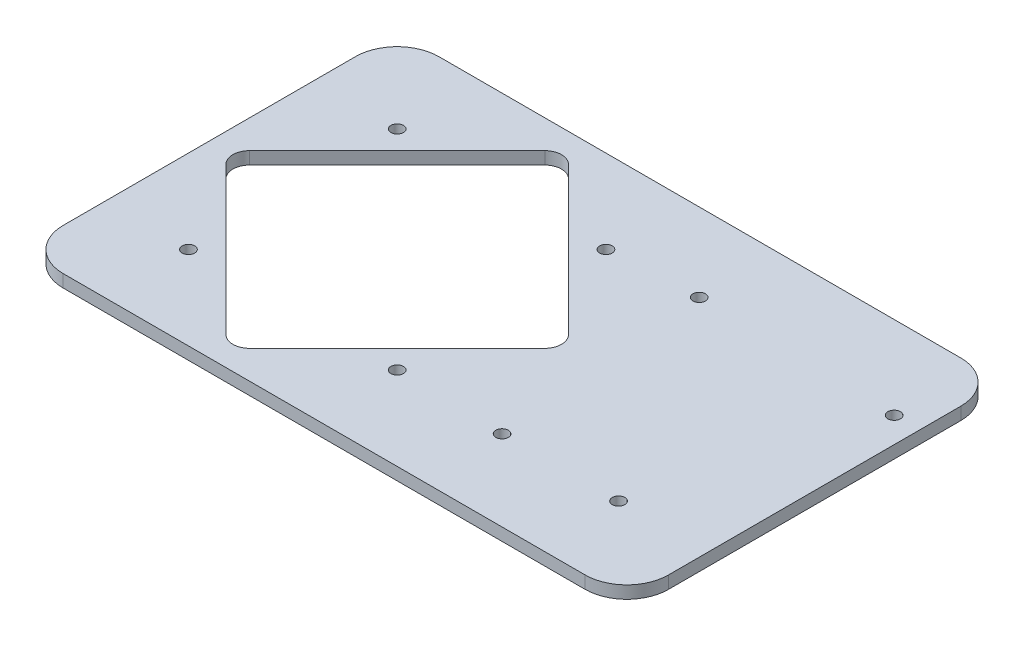
ISO-10303-21;
HEADER;
FILE_DESCRIPTION(('STEP AP214'),'2;1');
FILE_NAME('part.step','',(''),(''),'','','');
FILE_SCHEMA(('AUTOMOTIVE_DESIGN { 1 0 10303 214 1 1 1 1 }'));
ENDSEC;
DATA;
#1=APPLICATION_CONTEXT('core data for automotive mechanical design processes');
#2=APPLICATION_PROTOCOL_DEFINITION('international standard','automotive_design',2000,#1);
#3=PRODUCT_CONTEXT('',#1,'mechanical');
#4=PRODUCT('Part','Part','',(#3));
#5=PRODUCT_RELATED_PRODUCT_CATEGORY('part','',(#4));
#6=PRODUCT_DEFINITION_FORMATION('','',#4);
#7=PRODUCT_DEFINITION_CONTEXT('part definition',#1,'design');
#8=PRODUCT_DEFINITION('design','',#6,#7);
#9=PRODUCT_DEFINITION_SHAPE('','',#8);
#10=(LENGTH_UNIT() NAMED_UNIT(*) SI_UNIT(.MILLI.,.METRE.));
#11=(NAMED_UNIT(*) PLANE_ANGLE_UNIT() SI_UNIT($,.RADIAN.));
#12=(NAMED_UNIT(*) SI_UNIT($,.STERADIAN.) SOLID_ANGLE_UNIT());
#13=UNCERTAINTY_MEASURE_WITH_UNIT(LENGTH_MEASURE(1.E-05),#10,'distance_accuracy_value','');
#14=(GEOMETRIC_REPRESENTATION_CONTEXT(3) GLOBAL_UNCERTAINTY_ASSIGNED_CONTEXT((#13)) GLOBAL_UNIT_ASSIGNED_CONTEXT((#10,
#11,#12)) REPRESENTATION_CONTEXT('',''));
#15=CARTESIAN_POINT('',(0.,0.,0.));
#16=DIRECTION('',(0.,0.,1.));
#17=DIRECTION('',(1.,0.,0.));
#18=AXIS2_PLACEMENT_3D('',#15,#16,#17);
#19=CARTESIAN_POINT('',(0.,-3.,0.));
#20=DIRECTION('',(0.,1.,0.));
#21=DIRECTION('',(0.,0.,1.));
#22=AXIS2_PLACEMENT_3D('',#19,#20,#21);
#23=PLANE('',#22);
#24=CARTESIAN_POINT('',(18.5999999999997,-3.,-26.2249999999994));
#25=DIRECTION('',(0.,1.,0.));
#26=DIRECTION('',(0.,0.,1.));
#27=AXIS2_PLACEMENT_3D('',#24,#25,#26);
#28=CIRCLE('',#27,1.5);
#29=CARTESIAN_POINT('',(18.5999999999997,-3.,-24.7249999999994));
#30=VERTEX_POINT('',#29);
#31=EDGE_CURVE('E437',#30,#30,#28,.T.);
#32=ORIENTED_EDGE('',*,*,#31,.T.);
#33=EDGE_LOOP('',(#32));
#34=FACE_BOUND('',#33,.T.);
#35=CARTESIAN_POINT('',(23.3000000000002,-3.,25.6750000000005));
#36=DIRECTION('',(0.,1.,0.));
#37=DIRECTION('',(0.,0.,1.));
#38=AXIS2_PLACEMENT_3D('',#35,#36,#37);
#39=CIRCLE('',#38,1.5);
#40=CARTESIAN_POINT('',(23.3000000000002,-3.,27.1750000000005));
#41=VERTEX_POINT('',#40);
#42=EDGE_CURVE('E431',#41,#41,#39,.T.);
#43=ORIENTED_EDGE('',*,*,#42,.T.);
#44=EDGE_LOOP('',(#43));
#45=FACE_BOUND('',#44,.T.);
#46=CARTESIAN_POINT('',(51.2000000000002,-3.,25.6750000000002));
#47=DIRECTION('',(0.,1.,0.));
#48=DIRECTION('',(0.,0.,1.));
#49=AXIS2_PLACEMENT_3D('',#46,#47,#48);
#50=CIRCLE('',#49,1.5);
#51=CARTESIAN_POINT('',(51.2000000000002,-3.,27.1750000000002));
#52=VERTEX_POINT('',#51);
#53=EDGE_CURVE('E425',#52,#52,#50,.T.);
#54=ORIENTED_EDGE('',*,*,#53,.T.);
#55=EDGE_LOOP('',(#54));
#56=FACE_BOUND('',#55,.T.);
#57=CARTESIAN_POINT('',(66.3999999999997,-3.,-25.125));
#58=DIRECTION('',(0.,1.,0.));
#59=DIRECTION('',(0.,0.,1.));
#60=AXIS2_PLACEMENT_3D('',#57,#58,#59);
#61=CIRCLE('',#60,1.5);
#62=CARTESIAN_POINT('',(66.3999999999997,-3.,-23.625));
#63=VERTEX_POINT('',#62);
#64=EDGE_CURVE('E419',#63,#63,#61,.T.);
#65=ORIENTED_EDGE('',*,*,#64,.T.);
#66=EDGE_LOOP('',(#65));
#67=FACE_BOUND('',#66,.T.);
#68=CARTESIAN_POINT('',(-52.5,-3.,-25.));
#69=DIRECTION('',(0.,1.,0.));
#70=DIRECTION('',(0.,0.,1.));
#71=AXIS2_PLACEMENT_3D('',#68,#69,#70);
#72=CIRCLE('',#71,1.5);
#73=CARTESIAN_POINT('',(-52.5,-3.,-23.5));
#74=VERTEX_POINT('',#73);
#75=EDGE_CURVE('E413',#74,#74,#72,.T.);
#76=ORIENTED_EDGE('',*,*,#75,.T.);
#77=EDGE_LOOP('',(#76));
#78=FACE_BOUND('',#77,.T.);
#79=CARTESIAN_POINT('',(-2.49999999999999,-3.,-25.));
#80=DIRECTION('',(0.,1.,0.));
#81=DIRECTION('',(0.,0.,1.));
#82=AXIS2_PLACEMENT_3D('',#79,#80,#81);
#83=CIRCLE('',#82,1.5);
#84=CARTESIAN_POINT('',(-2.49999999999999,-3.,-23.5));
#85=VERTEX_POINT('',#84);
#86=EDGE_CURVE('E407',#85,#85,#83,.T.);
#87=ORIENTED_EDGE('',*,*,#86,.T.);
#88=EDGE_LOOP('',(#87));
#89=FACE_BOUND('',#88,.T.);
#90=CARTESIAN_POINT('',(-2.49999999999999,-3.,25.));
#91=DIRECTION('',(0.,1.,0.));
#92=DIRECTION('',(0.,0.,1.));
#93=AXIS2_PLACEMENT_3D('',#90,#91,#92);
#94=CIRCLE('',#93,1.5);
#95=CARTESIAN_POINT('',(-2.49999999999999,-3.,26.5));
#96=VERTEX_POINT('',#95);
#97=EDGE_CURVE('E401',#96,#96,#94,.T.);
#98=ORIENTED_EDGE('',*,*,#97,.T.);
#99=EDGE_LOOP('',(#98));
#100=FACE_BOUND('',#99,.T.);
#101=CARTESIAN_POINT('',(-52.5,-3.,25.));
#102=DIRECTION('',(0.,1.,0.));
#103=DIRECTION('',(0.,0.,1.));
#104=AXIS2_PLACEMENT_3D('',#101,#102,#103);
#105=CIRCLE('',#104,1.5);
#106=CARTESIAN_POINT('',(-52.5,-3.,26.5));
#107=VERTEX_POINT('',#106);
#108=EDGE_CURVE('E252',#107,#107,#105,.T.);
#109=ORIENTED_EDGE('',*,*,#108,.T.);
#110=EDGE_LOOP('',(#109));
#111=FACE_BOUND('',#110,.T.);
#112=DIRECTION('',(-1.,0.,0.));
#113=VECTOR('',#112,1.);
#114=CARTESIAN_POINT('',(-72.5,-3.,-45.));
#115=LINE('',#114,#113);
#116=CARTESIAN_POINT('',(62.5,-3.,-45.));
#117=VERTEX_POINT('',#116);
#118=CARTESIAN_POINT('',(-62.5,-3.,-45.));
#119=VERTEX_POINT('',#118);
#120=EDGE_CURVE('E272',#117,#119,#115,.T.);
#121=ORIENTED_EDGE('',*,*,#120,.F.);
#122=CARTESIAN_POINT('',(62.5,-3.,-35.));
#123=DIRECTION('',(0.,1.,0.));
#124=DIRECTION('',(0.,0.,1.));
#125=AXIS2_PLACEMENT_3D('',#122,#123,#124);
#126=CIRCLE('',#125,10.);
#127=CARTESIAN_POINT('',(72.5,-3.,-35.));
#128=VERTEX_POINT('',#127);
#129=EDGE_CURVE('E198',#117,#128,#126,.F.);
#130=ORIENTED_EDGE('',*,*,#129,.T.);
#131=DIRECTION('',(0.,0.,-1.));
#132=VECTOR('',#131,1.);
#133=CARTESIAN_POINT('',(72.5,-3.,-45.));
#134=LINE('',#133,#132);
#135=CARTESIAN_POINT('',(72.5,-3.,35.));
#136=VERTEX_POINT('',#135);
#137=EDGE_CURVE('E270',#136,#128,#134,.T.);
#138=ORIENTED_EDGE('',*,*,#137,.F.);
#139=CARTESIAN_POINT('',(62.5,-3.,35.));
#140=DIRECTION('',(0.,1.,0.));
#141=DIRECTION('',(0.,0.,1.));
#142=AXIS2_PLACEMENT_3D('',#139,#140,#141);
#143=CIRCLE('',#142,10.);
#144=CARTESIAN_POINT('',(62.5,-3.,45.));
#145=VERTEX_POINT('',#144);
#146=EDGE_CURVE('E173',#136,#145,#143,.F.);
#147=ORIENTED_EDGE('',*,*,#146,.T.);
#148=DIRECTION('',(1.,0.,0.));
#149=VECTOR('',#148,1.);
#150=CARTESIAN_POINT('',(-72.5,-3.,45.));
#151=LINE('',#150,#149);
#152=CARTESIAN_POINT('',(-62.5,-3.,45.));
#153=VERTEX_POINT('',#152);
#154=EDGE_CURVE('E174',#153,#145,#151,.T.);
#155=ORIENTED_EDGE('',*,*,#154,.F.);
#156=CARTESIAN_POINT('',(-62.5,-3.,35.));
#157=DIRECTION('',(0.,1.,0.));
#158=DIRECTION('',(0.,0.,1.));
#159=AXIS2_PLACEMENT_3D('',#156,#157,#158);
#160=CIRCLE('',#159,10.);
#161=CARTESIAN_POINT('',(-72.5,-3.,35.));
#162=VERTEX_POINT('',#161);
#163=EDGE_CURVE('E194',#153,#162,#160,.F.);
#164=ORIENTED_EDGE('',*,*,#163,.T.);
#165=DIRECTION('',(0.,0.,1.));
#166=VECTOR('',#165,1.);
#167=CARTESIAN_POINT('',(-72.5,-3.,-45.));
#168=LINE('',#167,#166);
#169=CARTESIAN_POINT('',(-72.5,-3.,-35.));
#170=VERTEX_POINT('',#169);
#171=EDGE_CURVE('E178',#170,#162,#168,.T.);
#172=ORIENTED_EDGE('',*,*,#171,.F.);
#173=CARTESIAN_POINT('',(-62.5,-3.,-35.));
#174=DIRECTION('',(0.,1.,0.));
#175=DIRECTION('',(0.,0.,1.));
#176=AXIS2_PLACEMENT_3D('',#173,#174,#175);
#177=CIRCLE('',#176,10.);
#178=EDGE_CURVE('E196',#170,#119,#177,.F.);
#179=ORIENTED_EDGE('',*,*,#178,.T.);
#180=EDGE_LOOP('',(#121,#130,#138,#147,#155,#164,#172,#179));
#181=FACE_BOUND('',#180,.T.);
#182=DIRECTION('',(0.707106781186551,0.,-0.707106781186544));
#183=VECTOR('',#182,1.);
#184=CARTESIAN_POINT('',(-68.5121933088197,-3.,-1.92968936989611E-13));
#185=LINE('',#184,#183);
#186=CARTESIAN_POINT('',(-65.6837661840735,-3.,-2.82842712474637));
#187=VERTEX_POINT('',#186);
#188=CARTESIAN_POINT('',(-30.328427124746,-3.,-38.1837661840735));
#189=VERTEX_POINT('',#188);
#190=EDGE_CURVE('E269',#187,#189,#185,.T.);
#191=ORIENTED_EDGE('',*,*,#190,.F.);
#192=CARTESIAN_POINT('',(-62.8553390593274,-3.,-1.6306400674182E-13));
#193=DIRECTION('',(0.,1.,0.));
#194=DIRECTION('',(0.,0.,1.));
#195=AXIS2_PLACEMENT_3D('',#192,#193,#194);
#196=CIRCLE('',#195,4.);
#197=CARTESIAN_POINT('',(-65.6837661840736,-3.,2.82842712474602));
#198=VERTEX_POINT('',#197);
#199=EDGE_CURVE('E11',#187,#198,#196,.T.);
#200=ORIENTED_EDGE('',*,*,#199,.T.);
#201=DIRECTION('',(0.707106781186544,0.,0.707106781186551));
#202=VECTOR('',#201,1.);
#203=CARTESIAN_POINT('',(-68.5121933088197,-3.,-1.92968936989611E-13));
#204=LINE('',#203,#202);
#205=CARTESIAN_POINT('',(-30.3284271247464,-3.,38.1837661840735));
#206=VERTEX_POINT('',#205);
#207=EDGE_CURVE('E169',#198,#206,#204,.T.);
#208=ORIENTED_EDGE('',*,*,#207,.T.);
#209=CARTESIAN_POINT('',(-27.5000000000002,-3.,35.3553390593274));
#210=DIRECTION('',(0.,1.,0.));
#211=DIRECTION('',(0.,0.,1.));
#212=AXIS2_PLACEMENT_3D('',#209,#210,#211);
#213=CIRCLE('',#212,4.);
#214=CARTESIAN_POINT('',(-24.671572875254,-3.,38.1837661840736));
#215=VERTEX_POINT('',#214);
#216=EDGE_CURVE('E238',#206,#215,#213,.T.);
#217=ORIENTED_EDGE('',*,*,#216,.T.);
#218=DIRECTION('',(0.707106781186552,0.,-0.707106781186543));
#219=VECTOR('',#218,1.);
#220=CARTESIAN_POINT('',(-27.5000000000002,-3.,41.0121933088197));
#221=LINE('',#220,#219);
#222=CARTESIAN_POINT('',(10.6837661840735,-3.,2.82842712474642));
#223=VERTEX_POINT('',#222);
#224=EDGE_CURVE('E256',#215,#223,#221,.T.);
#225=ORIENTED_EDGE('',*,*,#224,.T.);
#226=CARTESIAN_POINT('',(7.85533905932734,-3.,2.08166817117217E-13));
#227=DIRECTION('',(0.,1.,0.));
#228=DIRECTION('',(0.,0.,1.));
#229=AXIS2_PLACEMENT_3D('',#226,#227,#228);
#230=CIRCLE('',#229,4.);
#231=CARTESIAN_POINT('',(10.6837661840736,-3.,-2.82842712474597));
#232=VERTEX_POINT('',#231);
#233=EDGE_CURVE('E234',#223,#232,#230,.T.);
#234=ORIENTED_EDGE('',*,*,#233,.T.);
#235=DIRECTION('',(0.707106781186544,0.,0.707106781186551));
#236=VECTOR('',#235,1.);
#237=CARTESIAN_POINT('',(-27.4999999999998,-3.,-41.0121933088197));
#238=LINE('',#237,#236);
#239=CARTESIAN_POINT('',(-24.6715728752536,-3.,-38.1837661840735));
#240=VERTEX_POINT('',#239);
#241=EDGE_CURVE('E259',#240,#232,#238,.T.);
#242=ORIENTED_EDGE('',*,*,#241,.F.);
#243=CARTESIAN_POINT('',(-27.4999999999998,-3.,-35.3553390593273));
#244=DIRECTION('',(0.,1.,0.));
#245=DIRECTION('',(0.,0.,1.));
#246=AXIS2_PLACEMENT_3D('',#243,#244,#245);
#247=CIRCLE('',#246,4.);
#248=EDGE_CURVE('E230',#240,#189,#247,.T.);
#249=ORIENTED_EDGE('',*,*,#248,.T.);
#250=EDGE_LOOP('',(#191,#200,#208,#217,#225,#234,#242,#249));
#251=FACE_BOUND('',#250,.T.);
#252=ADVANCED_FACE('F34',(#34,#45,#56,#67,#78,#89,#100,#111,#181,#251),#23,.F.);
#253=CARTESIAN_POINT('',(0.,0.,0.));
#254=DIRECTION('',(0.,1.,0.));
#255=DIRECTION('',(0.,0.,1.));
#256=AXIS2_PLACEMENT_3D('',#253,#254,#255);
#257=PLANE('',#256);
#258=CARTESIAN_POINT('',(18.5999999999997,0.,-26.2249999999994));
#259=DIRECTION('',(0.,1.,0.));
#260=DIRECTION('',(0.,0.,1.));
#261=AXIS2_PLACEMENT_3D('',#258,#259,#260);
#262=CIRCLE('',#261,1.49999999999999);
#263=CARTESIAN_POINT('',(18.5999999999997,0.,-24.7249999999994));
#264=VERTEX_POINT('',#263);
#265=EDGE_CURVE('E439',#264,#264,#262,.T.);
#266=ORIENTED_EDGE('',*,*,#265,.F.);
#267=EDGE_LOOP('',(#266));
#268=FACE_BOUND('',#267,.T.);
#269=CARTESIAN_POINT('',(23.3000000000002,0.,25.6750000000005));
#270=DIRECTION('',(0.,1.,0.));
#271=DIRECTION('',(0.,0.,1.));
#272=AXIS2_PLACEMENT_3D('',#269,#270,#271);
#273=CIRCLE('',#272,1.49999999999999);
#274=CARTESIAN_POINT('',(23.3000000000002,0.,27.1750000000005));
#275=VERTEX_POINT('',#274);
#276=EDGE_CURVE('E434',#275,#275,#273,.T.);
#277=ORIENTED_EDGE('',*,*,#276,.F.);
#278=EDGE_LOOP('',(#277));
#279=FACE_BOUND('',#278,.T.);
#280=CARTESIAN_POINT('',(51.2000000000002,0.,25.6750000000002));
#281=DIRECTION('',(0.,1.,0.));
#282=DIRECTION('',(0.,0.,1.));
#283=AXIS2_PLACEMENT_3D('',#280,#281,#282);
#284=CIRCLE('',#283,1.49999999999999);
#285=CARTESIAN_POINT('',(51.2000000000002,0.,27.1750000000002));
#286=VERTEX_POINT('',#285);
#287=EDGE_CURVE('E428',#286,#286,#284,.T.);
#288=ORIENTED_EDGE('',*,*,#287,.F.);
#289=EDGE_LOOP('',(#288));
#290=FACE_BOUND('',#289,.T.);
#291=CARTESIAN_POINT('',(66.3999999999997,0.,-25.125));
#292=DIRECTION('',(0.,1.,0.));
#293=DIRECTION('',(0.,0.,1.));
#294=AXIS2_PLACEMENT_3D('',#291,#292,#293);
#295=CIRCLE('',#294,1.49999999999999);
#296=CARTESIAN_POINT('',(66.3999999999997,0.,-23.625));
#297=VERTEX_POINT('',#296);
#298=EDGE_CURVE('E422',#297,#297,#295,.T.);
#299=ORIENTED_EDGE('',*,*,#298,.F.);
#300=EDGE_LOOP('',(#299));
#301=FACE_BOUND('',#300,.T.);
#302=CARTESIAN_POINT('',(-52.5,0.,-25.));
#303=DIRECTION('',(0.,1.,0.));
#304=DIRECTION('',(0.,0.,1.));
#305=AXIS2_PLACEMENT_3D('',#302,#303,#304);
#306=CIRCLE('',#305,1.5);
#307=CARTESIAN_POINT('',(-52.5,0.,-23.5));
#308=VERTEX_POINT('',#307);
#309=EDGE_CURVE('E416',#308,#308,#306,.T.);
#310=ORIENTED_EDGE('',*,*,#309,.F.);
#311=EDGE_LOOP('',(#310));
#312=FACE_BOUND('',#311,.T.);
#313=CARTESIAN_POINT('',(-2.49999999999999,0.,-25.));
#314=DIRECTION('',(0.,1.,0.));
#315=DIRECTION('',(0.,0.,1.));
#316=AXIS2_PLACEMENT_3D('',#313,#314,#315);
#317=CIRCLE('',#316,1.5);
#318=CARTESIAN_POINT('',(-2.49999999999999,0.,-23.5));
#319=VERTEX_POINT('',#318);
#320=EDGE_CURVE('E410',#319,#319,#317,.T.);
#321=ORIENTED_EDGE('',*,*,#320,.F.);
#322=EDGE_LOOP('',(#321));
#323=FACE_BOUND('',#322,.T.);
#324=CARTESIAN_POINT('',(-2.49999999999999,0.,25.));
#325=DIRECTION('',(0.,1.,0.));
#326=DIRECTION('',(0.,0.,1.));
#327=AXIS2_PLACEMENT_3D('',#324,#325,#326);
#328=CIRCLE('',#327,1.5);
#329=CARTESIAN_POINT('',(-2.49999999999999,0.,26.5));
#330=VERTEX_POINT('',#329);
#331=EDGE_CURVE('E404',#330,#330,#328,.T.);
#332=ORIENTED_EDGE('',*,*,#331,.F.);
#333=EDGE_LOOP('',(#332));
#334=FACE_BOUND('',#333,.T.);
#335=CARTESIAN_POINT('',(-52.5,0.,25.));
#336=DIRECTION('',(0.,1.,0.));
#337=DIRECTION('',(0.,0.,1.));
#338=AXIS2_PLACEMENT_3D('',#335,#336,#337);
#339=CIRCLE('',#338,1.5);
#340=CARTESIAN_POINT('',(-52.5,0.,26.5));
#341=VERTEX_POINT('',#340);
#342=EDGE_CURVE('E398',#341,#341,#339,.T.);
#343=ORIENTED_EDGE('',*,*,#342,.F.);
#344=EDGE_LOOP('',(#343));
#345=FACE_BOUND('',#344,.T.);
#346=DIRECTION('',(0.,0.,-1.));
#347=VECTOR('',#346,1.);
#348=CARTESIAN_POINT('',(72.5,0.,-45.));
#349=LINE('',#348,#347);
#350=CARTESIAN_POINT('',(72.5,0.,35.));
#351=VERTEX_POINT('',#350);
#352=CARTESIAN_POINT('',(72.5,0.,-35.));
#353=VERTEX_POINT('',#352);
#354=EDGE_CURVE('E151',#351,#353,#349,.T.);
#355=ORIENTED_EDGE('',*,*,#354,.T.);
#356=CARTESIAN_POINT('',(62.5,0.,-35.));
#357=DIRECTION('',(0.,1.,0.));
#358=DIRECTION('',(0.,0.,1.));
#359=AXIS2_PLACEMENT_3D('',#356,#357,#358);
#360=CIRCLE('',#359,10.);
#361=CARTESIAN_POINT('',(62.5,0.,-45.));
#362=VERTEX_POINT('',#361);
#363=EDGE_CURVE('E186',#353,#362,#360,.T.);
#364=ORIENTED_EDGE('',*,*,#363,.T.);
#365=DIRECTION('',(-1.,0.,0.));
#366=VECTOR('',#365,1.);
#367=CARTESIAN_POINT('',(-72.5,0.,-45.));
#368=LINE('',#367,#366);
#369=CARTESIAN_POINT('',(-62.5,0.,-45.));
#370=VERTEX_POINT('',#369);
#371=EDGE_CURVE('E168',#362,#370,#368,.T.);
#372=ORIENTED_EDGE('',*,*,#371,.T.);
#373=CARTESIAN_POINT('',(-62.5,0.,-35.));
#374=DIRECTION('',(0.,1.,0.));
#375=DIRECTION('',(0.,0.,1.));
#376=AXIS2_PLACEMENT_3D('',#373,#374,#375);
#377=CIRCLE('',#376,10.);
#378=CARTESIAN_POINT('',(-72.5,0.,-35.));
#379=VERTEX_POINT('',#378);
#380=EDGE_CURVE('E184',#370,#379,#377,.T.);
#381=ORIENTED_EDGE('',*,*,#380,.T.);
#382=DIRECTION('',(0.,0.,1.));
#383=VECTOR('',#382,1.);
#384=CARTESIAN_POINT('',(-72.5,0.,-45.));
#385=LINE('',#384,#383);
#386=CARTESIAN_POINT('',(-72.5,0.,35.));
#387=VERTEX_POINT('',#386);
#388=EDGE_CURVE('E278',#379,#387,#385,.T.);
#389=ORIENTED_EDGE('',*,*,#388,.T.);
#390=CARTESIAN_POINT('',(-62.5,0.,35.));
#391=DIRECTION('',(0.,1.,0.));
#392=DIRECTION('',(0.,0.,1.));
#393=AXIS2_PLACEMENT_3D('',#390,#391,#392);
#394=CIRCLE('',#393,10.);
#395=CARTESIAN_POINT('',(-62.5,0.,45.));
#396=VERTEX_POINT('',#395);
#397=EDGE_CURVE('E158',#387,#396,#394,.T.);
#398=ORIENTED_EDGE('',*,*,#397,.T.);
#399=DIRECTION('',(1.,0.,0.));
#400=VECTOR('',#399,1.);
#401=CARTESIAN_POINT('',(-72.5,0.,45.));
#402=LINE('',#401,#400);
#403=CARTESIAN_POINT('',(62.5,0.,45.));
#404=VERTEX_POINT('',#403);
#405=EDGE_CURVE('E153',#396,#404,#402,.T.);
#406=ORIENTED_EDGE('',*,*,#405,.T.);
#407=CARTESIAN_POINT('',(62.5,0.,35.));
#408=DIRECTION('',(0.,1.,0.));
#409=DIRECTION('',(0.,0.,1.));
#410=AXIS2_PLACEMENT_3D('',#407,#408,#409);
#411=CIRCLE('',#410,10.);
#412=EDGE_CURVE('E147',#404,#351,#411,.T.);
#413=ORIENTED_EDGE('',*,*,#412,.T.);
#414=EDGE_LOOP('',(#355,#364,#372,#381,#389,#398,#406,#413));
#415=FACE_BOUND('',#414,.T.);
#416=DIRECTION('',(0.707106781186544,0.,0.707106781186551));
#417=VECTOR('',#416,1.);
#418=CARTESIAN_POINT('',(-68.5121933088197,0.,-1.92968936989611E-13));
#419=LINE('',#418,#417);
#420=CARTESIAN_POINT('',(-65.6837661840736,0.,2.82842712474602));
#421=VERTEX_POINT('',#420);
#422=CARTESIAN_POINT('',(-30.3284271247464,0.,38.1837661840735));
#423=VERTEX_POINT('',#422);
#424=EDGE_CURVE('E243',#421,#423,#419,.T.);
#425=ORIENTED_EDGE('',*,*,#424,.F.);
#426=CARTESIAN_POINT('',(-62.8553390593274,0.,-1.6306400674182E-13));
#427=DIRECTION('',(0.,1.,0.));
#428=DIRECTION('',(0.,0.,1.));
#429=AXIS2_PLACEMENT_3D('',#426,#427,#428);
#430=CIRCLE('',#429,4.);
#431=CARTESIAN_POINT('',(-65.6837661840735,0.,-2.82842712474637));
#432=VERTEX_POINT('',#431);
#433=EDGE_CURVE('E42',#421,#432,#430,.F.);
#434=ORIENTED_EDGE('',*,*,#433,.T.);
#435=DIRECTION('',(0.707106781186551,0.,-0.707106781186544));
#436=VECTOR('',#435,1.);
#437=CARTESIAN_POINT('',(-68.5121933088197,0.,-1.92968936989611E-13));
#438=LINE('',#437,#436);
#439=CARTESIAN_POINT('',(-30.328427124746,0.,-38.1837661840735));
#440=VERTEX_POINT('',#439);
#441=EDGE_CURVE('E242',#432,#440,#438,.T.);
#442=ORIENTED_EDGE('',*,*,#441,.T.);
#443=CARTESIAN_POINT('',(-27.4999999999998,0.,-35.3553390593273));
#444=DIRECTION('',(0.,1.,0.));
#445=DIRECTION('',(0.,0.,1.));
#446=AXIS2_PLACEMENT_3D('',#443,#444,#445);
#447=CIRCLE('',#446,4.);
#448=CARTESIAN_POINT('',(-24.6715728752536,0.,-38.1837661840735));
#449=VERTEX_POINT('',#448);
#450=EDGE_CURVE('E228',#440,#449,#447,.F.);
#451=ORIENTED_EDGE('',*,*,#450,.T.);
#452=DIRECTION('',(0.707106781186544,0.,0.707106781186551));
#453=VECTOR('',#452,1.);
#454=CARTESIAN_POINT('',(-27.4999999999998,0.,-41.0121933088197));
#455=LINE('',#454,#453);
#456=CARTESIAN_POINT('',(10.6837661840736,0.,-2.82842712474597));
#457=VERTEX_POINT('',#456);
#458=EDGE_CURVE('E251',#449,#457,#455,.T.);
#459=ORIENTED_EDGE('',*,*,#458,.T.);
#460=CARTESIAN_POINT('',(7.85533905932734,0.,2.08166817117217E-13));
#461=DIRECTION('',(0.,1.,0.));
#462=DIRECTION('',(0.,0.,1.));
#463=AXIS2_PLACEMENT_3D('',#460,#461,#462);
#464=CIRCLE('',#463,4.);
#465=CARTESIAN_POINT('',(10.6837661840735,0.,2.82842712474642));
#466=VERTEX_POINT('',#465);
#467=EDGE_CURVE('E232',#457,#466,#464,.F.);
#468=ORIENTED_EDGE('',*,*,#467,.T.);
#469=DIRECTION('',(0.707106781186552,0.,-0.707106781186543));
#470=VECTOR('',#469,1.);
#471=CARTESIAN_POINT('',(-27.5000000000002,0.,41.0121933088197));
#472=LINE('',#471,#470);
#473=CARTESIAN_POINT('',(-24.671572875254,0.,38.1837661840736));
#474=VERTEX_POINT('',#473);
#475=EDGE_CURVE('E265',#474,#466,#472,.T.);
#476=ORIENTED_EDGE('',*,*,#475,.F.);
#477=CARTESIAN_POINT('',(-27.5000000000002,0.,35.3553390593274));
#478=DIRECTION('',(0.,1.,0.));
#479=DIRECTION('',(0.,0.,1.));
#480=AXIS2_PLACEMENT_3D('',#477,#478,#479);
#481=CIRCLE('',#480,4.);
#482=EDGE_CURVE('E236',#474,#423,#481,.F.);
#483=ORIENTED_EDGE('',*,*,#482,.T.);
#484=EDGE_LOOP('',(#425,#434,#442,#451,#459,#468,#476,#483));
#485=FACE_BOUND('',#484,.T.);
#486=ADVANCED_FACE('F149',(#268,#279,#290,#301,#312,#323,#334,#345,#415,#485),#257,.T.);
#487=CARTESIAN_POINT('',(72.5,-3.,-45.));
#488=DIRECTION('',(1.,0.,0.));
#489=DIRECTION('',(0.,0.,-1.));
#490=AXIS2_PLACEMENT_3D('',#487,#488,#489);
#491=PLANE('',#490);
#492=ORIENTED_EDGE('',*,*,#137,.T.);
#493=DIRECTION('',(0.,1.,0.));
#494=VECTOR('',#493,1.);
#495=CARTESIAN_POINT('',(72.5,-3.,-35.));
#496=LINE('',#495,#494);
#497=EDGE_CURVE('E159',#128,#353,#496,.T.);
#498=ORIENTED_EDGE('',*,*,#497,.T.);
#499=ORIENTED_EDGE('',*,*,#354,.F.);
#500=DIRECTION('',(0.,1.,0.));
#501=VECTOR('',#500,1.);
#502=CARTESIAN_POINT('',(72.5,-3.,35.));
#503=LINE('',#502,#501);
#504=EDGE_CURVE('E165',#351,#136,#503,.F.);
#505=ORIENTED_EDGE('',*,*,#504,.T.);
#506=EDGE_LOOP('',(#492,#498,#499,#505));
#507=FACE_BOUND('',#506,.T.);
#508=ADVANCED_FACE('F164',(#507),#491,.T.);
#509=CARTESIAN_POINT('',(-72.5,-3.,45.));
#510=DIRECTION('',(0.,0.,1.));
#511=DIRECTION('',(1.,0.,0.));
#512=AXIS2_PLACEMENT_3D('',#509,#510,#511);
#513=PLANE('',#512);
#514=ORIENTED_EDGE('',*,*,#405,.F.);
#515=DIRECTION('',(0.,1.,0.));
#516=VECTOR('',#515,1.);
#517=CARTESIAN_POINT('',(-62.5,-3.,45.));
#518=LINE('',#517,#516);
#519=EDGE_CURVE('E207',#396,#153,#518,.F.);
#520=ORIENTED_EDGE('',*,*,#519,.T.);
#521=ORIENTED_EDGE('',*,*,#154,.T.);
#522=DIRECTION('',(0.,1.,0.));
#523=VECTOR('',#522,1.);
#524=CARTESIAN_POINT('',(62.5,-3.,45.));
#525=LINE('',#524,#523);
#526=EDGE_CURVE('E205',#145,#404,#525,.T.);
#527=ORIENTED_EDGE('',*,*,#526,.T.);
#528=EDGE_LOOP('',(#514,#520,#521,#527));
#529=FACE_BOUND('',#528,.T.);
#530=ADVANCED_FACE('F302',(#529),#513,.T.);
#531=CARTESIAN_POINT('',(-72.5,-3.,-45.));
#532=DIRECTION('',(-1.,0.,0.));
#533=DIRECTION('',(0.,0.,1.));
#534=AXIS2_PLACEMENT_3D('',#531,#532,#533);
#535=PLANE('',#534);
#536=ORIENTED_EDGE('',*,*,#388,.F.);
#537=DIRECTION('',(0.,1.,0.));
#538=VECTOR('',#537,1.);
#539=CARTESIAN_POINT('',(-72.5,-3.,-35.));
#540=LINE('',#539,#538);
#541=EDGE_CURVE('E203',#379,#170,#540,.F.);
#542=ORIENTED_EDGE('',*,*,#541,.T.);
#543=ORIENTED_EDGE('',*,*,#171,.T.);
#544=DIRECTION('',(0.,1.,0.));
#545=VECTOR('',#544,1.);
#546=CARTESIAN_POINT('',(-72.5,-3.,35.));
#547=LINE('',#546,#545);
#548=EDGE_CURVE('E200',#162,#387,#547,.T.);
#549=ORIENTED_EDGE('',*,*,#548,.T.);
#550=EDGE_LOOP('',(#536,#542,#543,#549));
#551=FACE_BOUND('',#550,.T.);
#552=ADVANCED_FACE('F283',(#551),#535,.T.);
#553=CARTESIAN_POINT('',(-72.5,-3.,-45.));
#554=DIRECTION('',(0.,0.,-1.));
#555=DIRECTION('',(-1.,0.,0.));
#556=AXIS2_PLACEMENT_3D('',#553,#554,#555);
#557=PLANE('',#556);
#558=ORIENTED_EDGE('',*,*,#371,.F.);
#559=DIRECTION('',(0.,1.,0.));
#560=VECTOR('',#559,1.);
#561=CARTESIAN_POINT('',(62.5,-3.,-45.));
#562=LINE('',#561,#560);
#563=EDGE_CURVE('E191',#362,#117,#562,.F.);
#564=ORIENTED_EDGE('',*,*,#563,.T.);
#565=ORIENTED_EDGE('',*,*,#120,.T.);
#566=DIRECTION('',(0.,1.,0.));
#567=VECTOR('',#566,1.);
#568=CARTESIAN_POINT('',(-62.5,-3.,-45.));
#569=LINE('',#568,#567);
#570=EDGE_CURVE('E188',#119,#370,#569,.T.);
#571=ORIENTED_EDGE('',*,*,#570,.T.);
#572=EDGE_LOOP('',(#558,#564,#565,#571));
#573=FACE_BOUND('',#572,.T.);
#574=ADVANCED_FACE('F295',(#573),#557,.T.);
#575=CARTESIAN_POINT('',(-68.5121933088197,-3.,-1.92968936989611E-13));
#576=DIRECTION('',(0.707106781186544,0.,0.707106781186551));
#577=DIRECTION('',(0.707106781186551,0.,-0.707106781186544));
#578=AXIS2_PLACEMENT_3D('',#575,#576,#577);
#579=PLANE('',#578);
#580=ORIENTED_EDGE('',*,*,#190,.T.);
#581=DIRECTION('',(0.,1.,0.));
#582=VECTOR('',#581,1.);
#583=CARTESIAN_POINT('',(-30.328427124746,0.,-38.1837661840735));
#584=LINE('',#583,#582);
#585=EDGE_CURVE('E211',#189,#440,#584,.T.);
#586=ORIENTED_EDGE('',*,*,#585,.T.);
#587=ORIENTED_EDGE('',*,*,#441,.F.);
#588=DIRECTION('',(0.,1.,0.));
#589=VECTOR('',#588,1.);
#590=CARTESIAN_POINT('',(-65.6837661840735,-3.,-2.82842712474637));
#591=LINE('',#590,#589);
#592=EDGE_CURVE('E209',#432,#187,#591,.F.);
#593=ORIENTED_EDGE('',*,*,#592,.T.);
#594=EDGE_LOOP('',(#580,#586,#587,#593));
#595=FACE_BOUND('',#594,.T.);
#596=ADVANCED_FACE('F249',(#595),#579,.T.);
#597=CARTESIAN_POINT('',(-27.4999999999998,-3.,-41.0121933088197));
#598=DIRECTION('',(-0.707106781186551,0.,0.707106781186544));
#599=DIRECTION('',(0.707106781186544,0.,0.707106781186551));
#600=AXIS2_PLACEMENT_3D('',#597,#598,#599);
#601=PLANE('',#600);
#602=ORIENTED_EDGE('',*,*,#458,.F.);
#603=DIRECTION('',(0.,1.,0.));
#604=VECTOR('',#603,1.);
#605=CARTESIAN_POINT('',(-24.6715728752536,-3.,-38.1837661840735));
#606=LINE('',#605,#604);
#607=EDGE_CURVE('E217',#449,#240,#606,.F.);
#608=ORIENTED_EDGE('',*,*,#607,.T.);
#609=ORIENTED_EDGE('',*,*,#241,.T.);
#610=DIRECTION('',(0.,1.,0.));
#611=VECTOR('',#610,1.);
#612=CARTESIAN_POINT('',(10.6837661840735,-3.,-2.82842712474597));
#613=LINE('',#612,#611);
#614=EDGE_CURVE('E214',#232,#457,#613,.T.);
#615=ORIENTED_EDGE('',*,*,#614,.T.);
#616=EDGE_LOOP('',(#602,#608,#609,#615));
#617=FACE_BOUND('',#616,.T.);
#618=ADVANCED_FACE('F380',(#617),#601,.T.);
#619=CARTESIAN_POINT('',(-27.5000000000002,-3.,41.0121933088197));
#620=DIRECTION('',(0.707106781186543,0.,0.707106781186552));
#621=DIRECTION('',(0.707106781186552,0.,-0.707106781186543));
#622=AXIS2_PLACEMENT_3D('',#619,#620,#621);
#623=PLANE('',#622);
#624=ORIENTED_EDGE('',*,*,#475,.T.);
#625=DIRECTION('',(0.,1.,0.));
#626=VECTOR('',#625,1.);
#627=CARTESIAN_POINT('',(10.6837661840735,-3.,2.82842712474642));
#628=LINE('',#627,#626);
#629=EDGE_CURVE('E222',#466,#223,#628,.F.);
#630=ORIENTED_EDGE('',*,*,#629,.T.);
#631=ORIENTED_EDGE('',*,*,#224,.F.);
#632=DIRECTION('',(0.,1.,0.));
#633=VECTOR('',#632,1.);
#634=CARTESIAN_POINT('',(-24.671572875254,0.,38.1837661840736));
#635=LINE('',#634,#633);
#636=EDGE_CURVE('E219',#215,#474,#635,.T.);
#637=ORIENTED_EDGE('',*,*,#636,.T.);
#638=EDGE_LOOP('',(#624,#630,#631,#637));
#639=FACE_BOUND('',#638,.T.);
#640=ADVANCED_FACE('F378',(#639),#623,.F.);
#641=CARTESIAN_POINT('',(-68.5121933088197,-3.,-1.92968936989611E-13));
#642=DIRECTION('',(-0.707106781186551,0.,0.707106781186544));
#643=DIRECTION('',(0.707106781186544,0.,0.707106781186551));
#644=AXIS2_PLACEMENT_3D('',#641,#642,#643);
#645=PLANE('',#644);
#646=ORIENTED_EDGE('',*,*,#424,.T.);
#647=DIRECTION('',(0.,1.,0.));
#648=VECTOR('',#647,1.);
#649=CARTESIAN_POINT('',(-30.3284271247464,-3.,38.1837661840735));
#650=LINE('',#649,#648);
#651=EDGE_CURVE('E49',#423,#206,#650,.F.);
#652=ORIENTED_EDGE('',*,*,#651,.T.);
#653=ORIENTED_EDGE('',*,*,#207,.F.);
#654=DIRECTION('',(0.,1.,0.));
#655=VECTOR('',#654,1.);
#656=CARTESIAN_POINT('',(-65.6837661840736,-3.,2.82842712474602));
#657=LINE('',#656,#655);
#658=EDGE_CURVE('E224',#198,#421,#657,.T.);
#659=ORIENTED_EDGE('',*,*,#658,.T.);
#660=EDGE_LOOP('',(#646,#652,#653,#659));
#661=FACE_BOUND('',#660,.T.);
#662=ADVANCED_FACE('F254',(#661),#645,.F.);
#663=CARTESIAN_POINT('',(-52.5,0.,25.));
#664=DIRECTION('',(0.,1.,0.));
#665=DIRECTION('',(0.,0.,1.));
#666=AXIS2_PLACEMENT_3D('',#663,#664,#665);
#667=CYLINDRICAL_SURFACE('',#666,1.5);
#668=ORIENTED_EDGE('',*,*,#108,.F.);
#669=EDGE_LOOP('',(#668));
#670=FACE_BOUND('',#669,.T.);
#671=ORIENTED_EDGE('',*,*,#342,.T.);
#672=EDGE_LOOP('',(#671));
#673=FACE_BOUND('',#672,.T.);
#674=ADVANCED_FACE('F371',(#670,#673),#667,.F.);
#675=CARTESIAN_POINT('',(-2.49999999999999,0.,25.));
#676=DIRECTION('',(0.,1.,0.));
#677=DIRECTION('',(0.,0.,1.));
#678=AXIS2_PLACEMENT_3D('',#675,#676,#677);
#679=CYLINDRICAL_SURFACE('',#678,1.5);
#680=ORIENTED_EDGE('',*,*,#97,.F.);
#681=EDGE_LOOP('',(#680));
#682=FACE_BOUND('',#681,.T.);
#683=ORIENTED_EDGE('',*,*,#331,.T.);
#684=EDGE_LOOP('',(#683));
#685=FACE_BOUND('',#684,.T.);
#686=ADVANCED_FACE('F367',(#682,#685),#679,.F.);
#687=CARTESIAN_POINT('',(-2.49999999999999,0.,-25.));
#688=DIRECTION('',(0.,1.,0.));
#689=DIRECTION('',(0.,0.,1.));
#690=AXIS2_PLACEMENT_3D('',#687,#688,#689);
#691=CYLINDRICAL_SURFACE('',#690,1.5);
#692=ORIENTED_EDGE('',*,*,#86,.F.);
#693=EDGE_LOOP('',(#692));
#694=FACE_BOUND('',#693,.T.);
#695=ORIENTED_EDGE('',*,*,#320,.T.);
#696=EDGE_LOOP('',(#695));
#697=FACE_BOUND('',#696,.T.);
#698=ADVANCED_FACE('F363',(#694,#697),#691,.F.);
#699=CARTESIAN_POINT('',(-52.5,0.,-25.));
#700=DIRECTION('',(0.,1.,0.));
#701=DIRECTION('',(0.,0.,1.));
#702=AXIS2_PLACEMENT_3D('',#699,#700,#701);
#703=CYLINDRICAL_SURFACE('',#702,1.5);
#704=ORIENTED_EDGE('',*,*,#75,.F.);
#705=EDGE_LOOP('',(#704));
#706=FACE_BOUND('',#705,.T.);
#707=ORIENTED_EDGE('',*,*,#309,.T.);
#708=EDGE_LOOP('',(#707));
#709=FACE_BOUND('',#708,.T.);
#710=ADVANCED_FACE('F359',(#706,#709),#703,.F.);
#711=CARTESIAN_POINT('',(66.3999999999997,0.,-25.125));
#712=DIRECTION('',(0.,1.,0.));
#713=DIRECTION('',(0.,0.,1.));
#714=AXIS2_PLACEMENT_3D('',#711,#712,#713);
#715=CYLINDRICAL_SURFACE('',#714,1.49999999999999);
#716=ORIENTED_EDGE('',*,*,#64,.F.);
#717=EDGE_LOOP('',(#716));
#718=FACE_BOUND('',#717,.T.);
#719=ORIENTED_EDGE('',*,*,#298,.T.);
#720=EDGE_LOOP('',(#719));
#721=FACE_BOUND('',#720,.T.);
#722=ADVANCED_FACE('F355',(#718,#721),#715,.F.);
#723=CARTESIAN_POINT('',(51.2000000000002,0.,25.6750000000002));
#724=DIRECTION('',(0.,1.,0.));
#725=DIRECTION('',(0.,0.,1.));
#726=AXIS2_PLACEMENT_3D('',#723,#724,#725);
#727=CYLINDRICAL_SURFACE('',#726,1.49999999999999);
#728=ORIENTED_EDGE('',*,*,#53,.F.);
#729=EDGE_LOOP('',(#728));
#730=FACE_BOUND('',#729,.T.);
#731=ORIENTED_EDGE('',*,*,#287,.T.);
#732=EDGE_LOOP('',(#731));
#733=FACE_BOUND('',#732,.T.);
#734=ADVANCED_FACE('F347',(#730,#733),#727,.F.);
#735=CARTESIAN_POINT('',(23.3000000000002,0.,25.6750000000005));
#736=DIRECTION('',(0.,1.,0.));
#737=DIRECTION('',(0.,0.,1.));
#738=AXIS2_PLACEMENT_3D('',#735,#736,#737);
#739=CYLINDRICAL_SURFACE('',#738,1.49999999999999);
#740=ORIENTED_EDGE('',*,*,#42,.F.);
#741=EDGE_LOOP('',(#740));
#742=FACE_BOUND('',#741,.T.);
#743=ORIENTED_EDGE('',*,*,#276,.T.);
#744=EDGE_LOOP('',(#743));
#745=FACE_BOUND('',#744,.T.);
#746=ADVANCED_FACE('F341',(#742,#745),#739,.F.);
#747=CARTESIAN_POINT('',(18.5999999999997,0.,-26.2249999999994));
#748=DIRECTION('',(0.,1.,0.));
#749=DIRECTION('',(0.,0.,1.));
#750=AXIS2_PLACEMENT_3D('',#747,#748,#749);
#751=CYLINDRICAL_SURFACE('',#750,1.49999999999999);
#752=ORIENTED_EDGE('',*,*,#31,.F.);
#753=EDGE_LOOP('',(#752));
#754=FACE_BOUND('',#753,.T.);
#755=ORIENTED_EDGE('',*,*,#265,.T.);
#756=EDGE_LOOP('',(#755));
#757=FACE_BOUND('',#756,.T.);
#758=ADVANCED_FACE('F337',(#754,#757),#751,.F.);
#759=CARTESIAN_POINT('',(62.5,-3.,-35.));
#760=DIRECTION('',(0.,1.,0.));
#761=DIRECTION('',(0.,0.,1.));
#762=AXIS2_PLACEMENT_3D('',#759,#760,#761);
#763=CYLINDRICAL_SURFACE('',#762,10.);
#764=ORIENTED_EDGE('',*,*,#129,.F.);
#765=ORIENTED_EDGE('',*,*,#563,.F.);
#766=ORIENTED_EDGE('',*,*,#363,.F.);
#767=ORIENTED_EDGE('',*,*,#497,.F.);
#768=EDGE_LOOP('',(#764,#765,#766,#767));
#769=FACE_BOUND('',#768,.T.);
#770=ADVANCED_FACE('F298',(#769),#763,.T.);
#771=CARTESIAN_POINT('',(-62.5,-3.,-35.));
#772=DIRECTION('',(0.,1.,0.));
#773=DIRECTION('',(0.,0.,1.));
#774=AXIS2_PLACEMENT_3D('',#771,#772,#773);
#775=CYLINDRICAL_SURFACE('',#774,10.);
#776=ORIENTED_EDGE('',*,*,#178,.F.);
#777=ORIENTED_EDGE('',*,*,#541,.F.);
#778=ORIENTED_EDGE('',*,*,#380,.F.);
#779=ORIENTED_EDGE('',*,*,#570,.F.);
#780=EDGE_LOOP('',(#776,#777,#778,#779));
#781=FACE_BOUND('',#780,.T.);
#782=ADVANCED_FACE('F288',(#781),#775,.T.);
#783=CARTESIAN_POINT('',(-62.5,-3.,35.));
#784=DIRECTION('',(0.,1.,0.));
#785=DIRECTION('',(0.,0.,1.));
#786=AXIS2_PLACEMENT_3D('',#783,#784,#785);
#787=CYLINDRICAL_SURFACE('',#786,10.);
#788=ORIENTED_EDGE('',*,*,#163,.F.);
#789=ORIENTED_EDGE('',*,*,#519,.F.);
#790=ORIENTED_EDGE('',*,*,#397,.F.);
#791=ORIENTED_EDGE('',*,*,#548,.F.);
#792=EDGE_LOOP('',(#788,#789,#790,#791));
#793=FACE_BOUND('',#792,.T.);
#794=ADVANCED_FACE('F305',(#793),#787,.T.);
#795=CARTESIAN_POINT('',(62.5,-3.,35.));
#796=DIRECTION('',(0.,1.,0.));
#797=DIRECTION('',(0.,0.,1.));
#798=AXIS2_PLACEMENT_3D('',#795,#796,#797);
#799=CYLINDRICAL_SURFACE('',#798,10.);
#800=ORIENTED_EDGE('',*,*,#146,.F.);
#801=ORIENTED_EDGE('',*,*,#504,.F.);
#802=ORIENTED_EDGE('',*,*,#412,.F.);
#803=ORIENTED_EDGE('',*,*,#526,.F.);
#804=EDGE_LOOP('',(#800,#801,#802,#803));
#805=FACE_BOUND('',#804,.T.);
#806=ADVANCED_FACE('F172',(#805),#799,.T.);
#807=CARTESIAN_POINT('',(-27.4999999999998,-3.,-35.3553390593273));
#808=DIRECTION('',(0.,-1.,0.));
#809=DIRECTION('',(0.,0.,-1.));
#810=AXIS2_PLACEMENT_3D('',#807,#808,#809);
#811=CYLINDRICAL_SURFACE('',#810,4.);
#812=ORIENTED_EDGE('',*,*,#248,.F.);
#813=ORIENTED_EDGE('',*,*,#607,.F.);
#814=ORIENTED_EDGE('',*,*,#450,.F.);
#815=ORIENTED_EDGE('',*,*,#585,.F.);
#816=EDGE_LOOP('',(#812,#813,#814,#815));
#817=FACE_BOUND('',#816,.T.);
#818=ADVANCED_FACE('F312',(#817),#811,.F.);
#819=CARTESIAN_POINT('',(7.85533905932734,-3.,2.08166817117217E-13));
#820=DIRECTION('',(0.,1.,0.));
#821=DIRECTION('',(0.,0.,1.));
#822=AXIS2_PLACEMENT_3D('',#819,#820,#821);
#823=CYLINDRICAL_SURFACE('',#822,4.);
#824=ORIENTED_EDGE('',*,*,#233,.F.);
#825=ORIENTED_EDGE('',*,*,#629,.F.);
#826=ORIENTED_EDGE('',*,*,#467,.F.);
#827=ORIENTED_EDGE('',*,*,#614,.F.);
#828=EDGE_LOOP('',(#824,#825,#826,#827));
#829=FACE_BOUND('',#828,.T.);
#830=ADVANCED_FACE('F478',(#829),#823,.F.);
#831=CARTESIAN_POINT('',(-27.5000000000002,-3.,35.3553390593274));
#832=DIRECTION('',(0.,-1.,0.));
#833=DIRECTION('',(0.,0.,-1.));
#834=AXIS2_PLACEMENT_3D('',#831,#832,#833);
#835=CYLINDRICAL_SURFACE('',#834,4.);
#836=ORIENTED_EDGE('',*,*,#216,.F.);
#837=ORIENTED_EDGE('',*,*,#651,.F.);
#838=ORIENTED_EDGE('',*,*,#482,.F.);
#839=ORIENTED_EDGE('',*,*,#636,.F.);
#840=EDGE_LOOP('',(#836,#837,#838,#839));
#841=FACE_BOUND('',#840,.T.);
#842=ADVANCED_FACE('F484',(#841),#835,.F.);
#843=CARTESIAN_POINT('',(-62.8553390593274,-3.,-1.6306400674182E-13));
#844=DIRECTION('',(0.,1.,0.));
#845=DIRECTION('',(0.,0.,1.));
#846=AXIS2_PLACEMENT_3D('',#843,#844,#845);
#847=CYLINDRICAL_SURFACE('',#846,4.);
#848=ORIENTED_EDGE('',*,*,#199,.F.);
#849=ORIENTED_EDGE('',*,*,#592,.F.);
#850=ORIENTED_EDGE('',*,*,#433,.F.);
#851=ORIENTED_EDGE('',*,*,#658,.F.);
#852=EDGE_LOOP('',(#848,#849,#850,#851));
#853=FACE_BOUND('',#852,.T.);
#854=ADVANCED_FACE('F36',(#853),#847,.F.);
#855=CLOSED_SHELL('',(#252,#486,#508,#530,#552,#574,#596,#618,#640,#662,#674,#686,#698,#710,
#722,#734,#746,#758,#770,#782,#794,#806,#818,#830,#842,#854));
#856=MANIFOLD_SOLID_BREP('B2',#855);
#857=ADVANCED_BREP_SHAPE_REPRESENTATION('',(#18,#856),#14);
#858=SHAPE_DEFINITION_REPRESENTATION(#9,#857);
ENDSEC;
END-ISO-10303-21;
